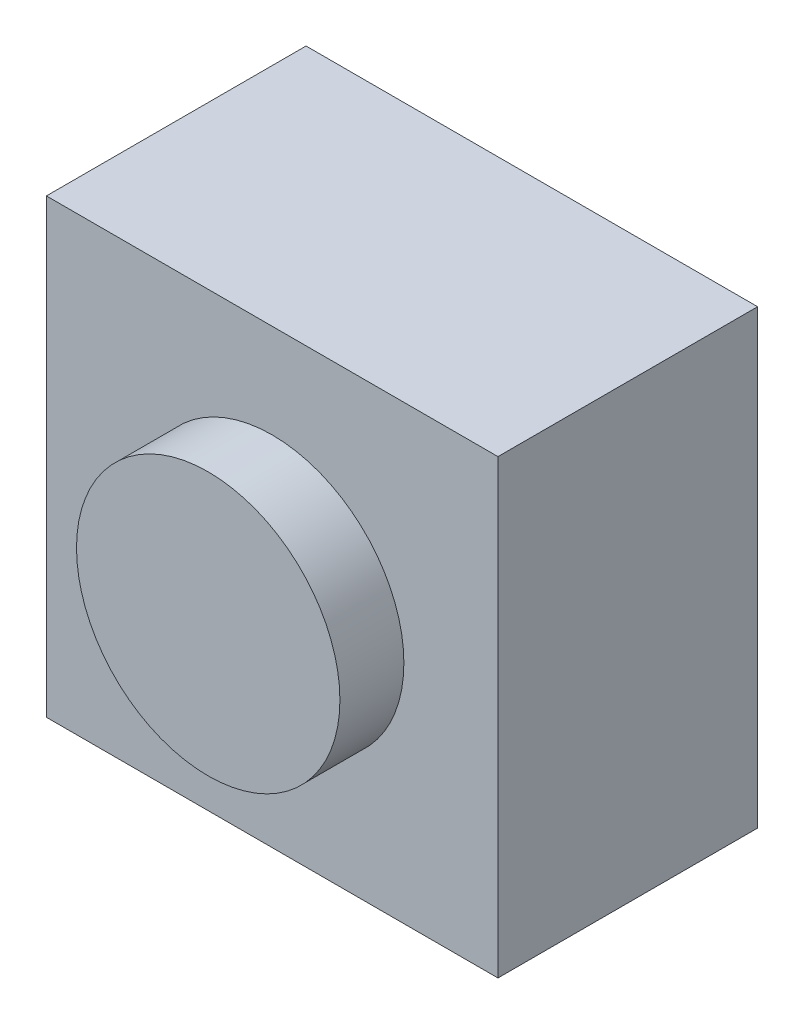
ISO-10303-21;
HEADER;
FILE_DESCRIPTION(('STEP AP214'),'2;1');
FILE_NAME('part.step','',(''),(''),'','','');
FILE_SCHEMA(('AUTOMOTIVE_DESIGN { 1 0 10303 214 1 1 1 1 }'));
ENDSEC;
DATA;
#1=APPLICATION_CONTEXT('core data for automotive mechanical design processes');
#2=APPLICATION_PROTOCOL_DEFINITION('international standard','automotive_design',2000,#1);
#3=PRODUCT_CONTEXT('',#1,'mechanical');
#4=PRODUCT('Part','Part','',(#3));
#5=PRODUCT_RELATED_PRODUCT_CATEGORY('part','',(#4));
#6=PRODUCT_DEFINITION_FORMATION('','',#4);
#7=PRODUCT_DEFINITION_CONTEXT('part definition',#1,'design');
#8=PRODUCT_DEFINITION('design','',#6,#7);
#9=PRODUCT_DEFINITION_SHAPE('','',#8);
#10=(LENGTH_UNIT() NAMED_UNIT(*) SI_UNIT(.MILLI.,.METRE.));
#11=(NAMED_UNIT(*) PLANE_ANGLE_UNIT() SI_UNIT($,.RADIAN.));
#12=(NAMED_UNIT(*) SI_UNIT($,.STERADIAN.) SOLID_ANGLE_UNIT());
#13=UNCERTAINTY_MEASURE_WITH_UNIT(LENGTH_MEASURE(1.E-05),#10,'distance_accuracy_value','');
#14=(GEOMETRIC_REPRESENTATION_CONTEXT(3) GLOBAL_UNCERTAINTY_ASSIGNED_CONTEXT((#13)) GLOBAL_UNIT_ASSIGNED_CONTEXT((#10,
#11,#12)) REPRESENTATION_CONTEXT('',''));
#15=CARTESIAN_POINT('',(0.,0.,0.));
#16=DIRECTION('',(0.,0.,1.));
#17=DIRECTION('',(1.,0.,0.));
#18=AXIS2_PLACEMENT_3D('',#15,#16,#17);
#19=CARTESIAN_POINT('',(-3.,3.,3.45));
#20=DIRECTION('',(1.,0.,0.));
#21=DIRECTION('',(0.,1.,0.));
#22=AXIS2_PLACEMENT_3D('',#19,#20,#21);
#23=PLANE('',#22);
#24=DIRECTION('',(0.,-1.,0.));
#25=VECTOR('',#24,1.);
#26=CARTESIAN_POINT('',(-3.,3.,0.));
#27=LINE('',#26,#25);
#28=CARTESIAN_POINT('',(-3.,3.,0.));
#29=VERTEX_POINT('',#28);
#30=CARTESIAN_POINT('',(-3.,-3.,0.));
#31=VERTEX_POINT('',#30);
#32=EDGE_CURVE('E105',#29,#31,#27,.T.);
#33=ORIENTED_EDGE('',*,*,#32,.T.);
#34=DIRECTION('',(0.,0.,-1.));
#35=VECTOR('',#34,1.);
#36=CARTESIAN_POINT('',(-3.,-3.,3.45));
#37=LINE('',#36,#35);
#38=CARTESIAN_POINT('',(-3.,-3.,3.45));
#39=VERTEX_POINT('',#38);
#40=EDGE_CURVE('E42',#39,#31,#37,.T.);
#41=ORIENTED_EDGE('',*,*,#40,.F.);
#42=DIRECTION('',(0.,-1.,0.));
#43=VECTOR('',#42,1.);
#44=CARTESIAN_POINT('',(-3.,3.,3.45));
#45=LINE('',#44,#43);
#46=CARTESIAN_POINT('',(-3.,3.,3.45));
#47=VERTEX_POINT('',#46);
#48=EDGE_CURVE('E92',#47,#39,#45,.T.);
#49=ORIENTED_EDGE('',*,*,#48,.F.);
#50=DIRECTION('',(0.,0.,-1.));
#51=VECTOR('',#50,1.);
#52=CARTESIAN_POINT('',(-3.,3.,3.45));
#53=LINE('',#52,#51);
#54=EDGE_CURVE('E101',#47,#29,#53,.T.);
#55=ORIENTED_EDGE('',*,*,#54,.T.);
#56=EDGE_LOOP('',(#33,#41,#49,#55));
#57=FACE_BOUND('',#56,.T.);
#58=ADVANCED_FACE('F39',(#57),#23,.F.);
#59=CARTESIAN_POINT('',(3.,-3.,3.45));
#60=DIRECTION('',(0.,1.,0.));
#61=DIRECTION('',(-1.,0.,0.));
#62=AXIS2_PLACEMENT_3D('',#59,#60,#61);
#63=PLANE('',#62);
#64=DIRECTION('',(1.,0.,0.));
#65=VECTOR('',#64,1.);
#66=CARTESIAN_POINT('',(3.,-3.,0.));
#67=LINE('',#66,#65);
#68=CARTESIAN_POINT('',(3.,-3.,0.));
#69=VERTEX_POINT('',#68);
#70=EDGE_CURVE('E97',#31,#69,#67,.T.);
#71=ORIENTED_EDGE('',*,*,#70,.T.);
#72=DIRECTION('',(0.,0.,-1.));
#73=VECTOR('',#72,1.);
#74=CARTESIAN_POINT('',(3.,-3.,3.45));
#75=LINE('',#74,#73);
#76=CARTESIAN_POINT('',(3.,-3.,3.45));
#77=VERTEX_POINT('',#76);
#78=EDGE_CURVE('E95',#77,#69,#75,.T.);
#79=ORIENTED_EDGE('',*,*,#78,.F.);
#80=DIRECTION('',(1.,0.,0.));
#81=VECTOR('',#80,1.);
#82=CARTESIAN_POINT('',(3.,-3.,3.45));
#83=LINE('',#82,#81);
#84=EDGE_CURVE('E87',#39,#77,#83,.T.);
#85=ORIENTED_EDGE('',*,*,#84,.F.);
#86=ORIENTED_EDGE('',*,*,#40,.T.);
#87=EDGE_LOOP('',(#71,#79,#85,#86));
#88=FACE_BOUND('',#87,.T.);
#89=ADVANCED_FACE('F96',(#88),#63,.F.);
#90=CARTESIAN_POINT('',(3.,3.,3.45));
#91=DIRECTION('',(-1.,0.,0.));
#92=DIRECTION('',(0.,-1.,0.));
#93=AXIS2_PLACEMENT_3D('',#90,#91,#92);
#94=PLANE('',#93);
#95=DIRECTION('',(0.,1.,0.));
#96=VECTOR('',#95,1.);
#97=CARTESIAN_POINT('',(3.,3.,0.));
#98=LINE('',#97,#96);
#99=CARTESIAN_POINT('',(3.,3.,0.));
#100=VERTEX_POINT('',#99);
#101=EDGE_CURVE('E73',#69,#100,#98,.T.);
#102=ORIENTED_EDGE('',*,*,#101,.T.);
#103=DIRECTION('',(0.,0.,-1.));
#104=VECTOR('',#103,1.);
#105=CARTESIAN_POINT('',(3.,3.,3.45));
#106=LINE('',#105,#104);
#107=CARTESIAN_POINT('',(3.,3.,3.45));
#108=VERTEX_POINT('',#107);
#109=EDGE_CURVE('E98',#108,#100,#106,.T.);
#110=ORIENTED_EDGE('',*,*,#109,.F.);
#111=DIRECTION('',(0.,1.,0.));
#112=VECTOR('',#111,1.);
#113=CARTESIAN_POINT('',(3.,3.,3.45));
#114=LINE('',#113,#112);
#115=EDGE_CURVE('E90',#77,#108,#114,.T.);
#116=ORIENTED_EDGE('',*,*,#115,.F.);
#117=ORIENTED_EDGE('',*,*,#78,.T.);
#118=EDGE_LOOP('',(#102,#110,#116,#117));
#119=FACE_BOUND('',#118,.T.);
#120=ADVANCED_FACE('F99',(#119),#94,.F.);
#121=CARTESIAN_POINT('',(3.,3.,3.45));
#122=DIRECTION('',(0.,-1.,0.));
#123=DIRECTION('',(1.,0.,0.));
#124=AXIS2_PLACEMENT_3D('',#121,#122,#123);
#125=PLANE('',#124);
#126=DIRECTION('',(-1.,0.,0.));
#127=VECTOR('',#126,1.);
#128=CARTESIAN_POINT('',(3.,3.,0.));
#129=LINE('',#128,#127);
#130=EDGE_CURVE('E79',#100,#29,#129,.T.);
#131=ORIENTED_EDGE('',*,*,#130,.T.);
#132=ORIENTED_EDGE('',*,*,#54,.F.);
#133=DIRECTION('',(-1.,0.,0.));
#134=VECTOR('',#133,1.);
#135=CARTESIAN_POINT('',(3.,3.,3.45));
#136=LINE('',#135,#134);
#137=EDGE_CURVE('E56',#108,#47,#136,.T.);
#138=ORIENTED_EDGE('',*,*,#137,.F.);
#139=ORIENTED_EDGE('',*,*,#109,.T.);
#140=EDGE_LOOP('',(#131,#132,#138,#139));
#141=FACE_BOUND('',#140,.T.);
#142=ADVANCED_FACE('F113',(#141),#125,.F.);
#143=CARTESIAN_POINT('',(0.,0.,3.45));
#144=DIRECTION('',(0.,0.,-1.));
#145=DIRECTION('',(-1.,0.,0.));
#146=AXIS2_PLACEMENT_3D('',#143,#144,#145);
#147=PLANE('',#146);
#148=CARTESIAN_POINT('',(0.,0.,3.45));
#149=DIRECTION('',(0.,0.,1.));
#150=DIRECTION('',(1.,0.,0.));
#151=AXIS2_PLACEMENT_3D('',#148,#149,#150);
#152=CIRCLE('',#151,1.75);
#153=CARTESIAN_POINT('',(1.75,0.,3.45));
#154=VERTEX_POINT('',#153);
#155=EDGE_CURVE('E12',#154,#154,#152,.T.);
#156=ORIENTED_EDGE('',*,*,#155,.F.);
#157=EDGE_LOOP('',(#156));
#158=FACE_BOUND('',#157,.T.);
#159=ORIENTED_EDGE('',*,*,#48,.T.);
#160=ORIENTED_EDGE('',*,*,#84,.T.);
#161=ORIENTED_EDGE('',*,*,#115,.T.);
#162=ORIENTED_EDGE('',*,*,#137,.T.);
#163=EDGE_LOOP('',(#159,#160,#161,#162));
#164=FACE_BOUND('',#163,.T.);
#165=ADVANCED_FACE('F88',(#158,#164),#147,.F.);
#166=CARTESIAN_POINT('',(0.,0.,0.));
#167=DIRECTION('',(0.,0.,-1.));
#168=DIRECTION('',(-1.,0.,0.));
#169=AXIS2_PLACEMENT_3D('',#166,#167,#168);
#170=PLANE('',#169);
#171=ORIENTED_EDGE('',*,*,#32,.F.);
#172=ORIENTED_EDGE('',*,*,#130,.F.);
#173=ORIENTED_EDGE('',*,*,#101,.F.);
#174=ORIENTED_EDGE('',*,*,#70,.F.);
#175=EDGE_LOOP('',(#171,#172,#173,#174));
#176=FACE_BOUND('',#175,.T.);
#177=ADVANCED_FACE('F116',(#176),#170,.T.);
#178=CARTESIAN_POINT('',(0.,0.,13.5497474683058));
#179=DIRECTION('',(0.,0.,-1.));
#180=DIRECTION('',(-1.,0.,0.));
#181=AXIS2_PLACEMENT_3D('',#178,#179,#180);
#182=CYLINDRICAL_SURFACE('',#181,1.75);
#183=CARTESIAN_POINT('',(0.,0.,4.3));
#184=DIRECTION('',(0.,0.,-1.));
#185=DIRECTION('',(-1.,0.,0.));
#186=AXIS2_PLACEMENT_3D('',#183,#184,#185);
#187=CIRCLE('',#186,1.75);
#188=CARTESIAN_POINT('',(-1.75,0.,4.3));
#189=VERTEX_POINT('',#188);
#190=EDGE_CURVE('E108',#189,#189,#187,.T.);
#191=ORIENTED_EDGE('',*,*,#190,.T.);
#192=EDGE_LOOP('',(#191));
#193=FACE_BOUND('',#192,.T.);
#194=ORIENTED_EDGE('',*,*,#155,.T.);
#195=EDGE_LOOP('',(#194));
#196=FACE_BOUND('',#195,.T.);
#197=ADVANCED_FACE('F122',(#193,#196),#182,.T.);
#198=CARTESIAN_POINT('',(0.,0.,4.3));
#199=DIRECTION('',(0.,0.,-1.));
#200=DIRECTION('',(-1.,0.,0.));
#201=AXIS2_PLACEMENT_3D('',#198,#199,#200);
#202=PLANE('',#201);
#203=ORIENTED_EDGE('',*,*,#190,.F.);
#204=EDGE_LOOP('',(#203));
#205=FACE_BOUND('',#204,.T.);
#206=ADVANCED_FACE('F125',(#205),#202,.F.);
#207=CLOSED_SHELL('',(#58,#89,#120,#142,#165,#177,#197,#206));
#208=MANIFOLD_SOLID_BREP('B2',#207);
#209=ADVANCED_BREP_SHAPE_REPRESENTATION('',(#18,#208),#14);
#210=SHAPE_DEFINITION_REPRESENTATION(#9,#209);
ENDSEC;
END-ISO-10303-21;
